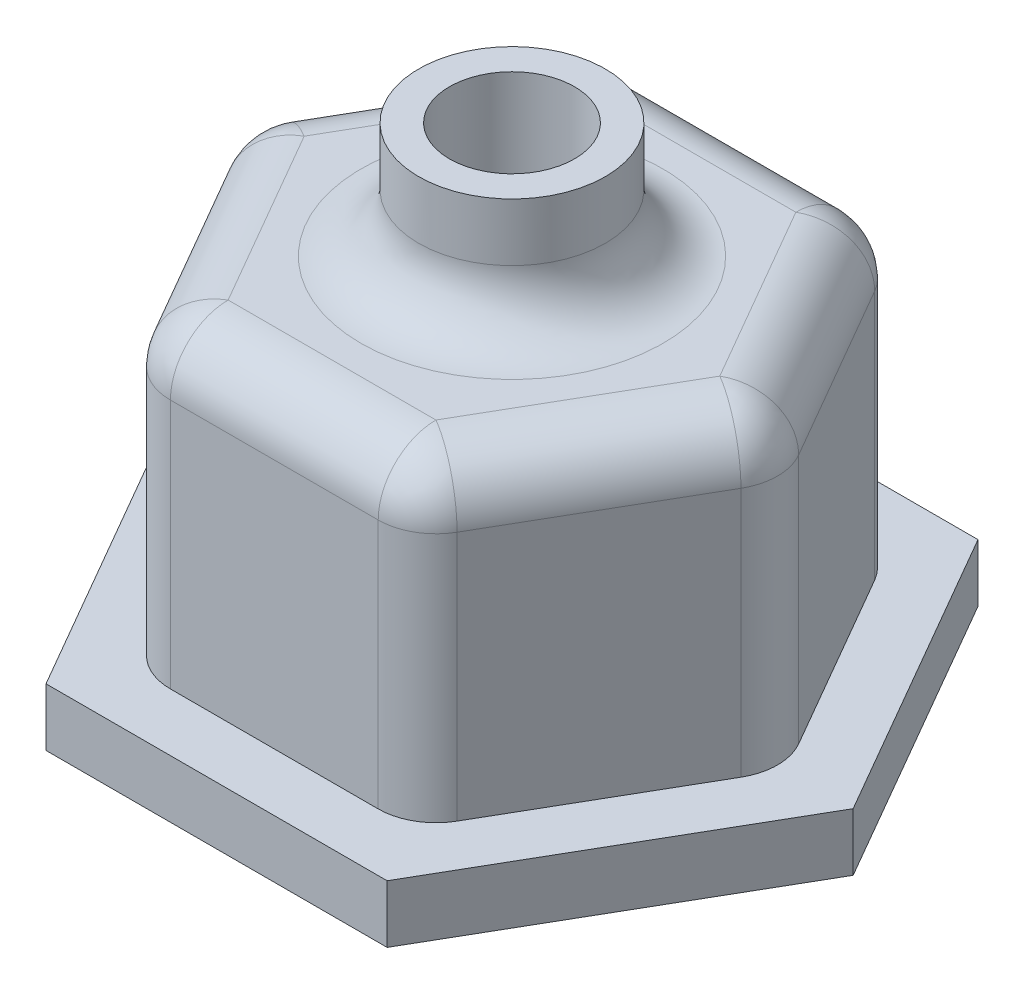
ISO-10303-21;
HEADER;
FILE_DESCRIPTION(('STEP AP214'),'2;1');
FILE_NAME('part.step','',(''),(''),'','','');
FILE_SCHEMA(('AUTOMOTIVE_DESIGN { 1 0 10303 214 1 1 1 1 }'));
ENDSEC;
DATA;
#1=APPLICATION_CONTEXT('core data for automotive mechanical design processes');
#2=APPLICATION_PROTOCOL_DEFINITION('international standard','automotive_design',2000,#1);
#3=PRODUCT_CONTEXT('',#1,'mechanical');
#4=PRODUCT('Part','Part','',(#3));
#5=PRODUCT_RELATED_PRODUCT_CATEGORY('part','',(#4));
#6=PRODUCT_DEFINITION_FORMATION('','',#4);
#7=PRODUCT_DEFINITION_CONTEXT('part definition',#1,'design');
#8=PRODUCT_DEFINITION('design','',#6,#7);
#9=PRODUCT_DEFINITION_SHAPE('','',#8);
#10=(LENGTH_UNIT() NAMED_UNIT(*) SI_UNIT(.MILLI.,.METRE.));
#11=(NAMED_UNIT(*) PLANE_ANGLE_UNIT() SI_UNIT($,.RADIAN.));
#12=(NAMED_UNIT(*) SI_UNIT($,.STERADIAN.) SOLID_ANGLE_UNIT());
#13=UNCERTAINTY_MEASURE_WITH_UNIT(LENGTH_MEASURE(1.E-05),#10,'distance_accuracy_value','');
#14=(GEOMETRIC_REPRESENTATION_CONTEXT(3) GLOBAL_UNCERTAINTY_ASSIGNED_CONTEXT((#13)) GLOBAL_UNIT_ASSIGNED_CONTEXT((#10,
#11,#12)) REPRESENTATION_CONTEXT('',''));
#15=CARTESIAN_POINT('',(0.,0.,0.));
#16=DIRECTION('',(0.,0.,1.));
#17=DIRECTION('',(1.,0.,0.));
#18=AXIS2_PLACEMENT_3D('',#15,#16,#17);
#19=CARTESIAN_POINT('',(0.,8.,0.));
#20=DIRECTION('',(0.,1.,0.));
#21=DIRECTION('',(0.,0.,1.));
#22=AXIS2_PLACEMENT_3D('',#19,#20,#21);
#23=PLANE('',#22);
#24=DIRECTION('',(0.,0.,1.));
#25=VECTOR('',#24,1.);
#26=CARTESIAN_POINT('',(-1.15,8.,-1.1480962503205));
#27=LINE('',#26,#25);
#28=CARTESIAN_POINT('',(-1.15,8.,-1.1480962503205));
#29=VERTEX_POINT('',#28);
#30=CARTESIAN_POINT('',(-1.15,8.,1.1480962503205));
#31=VERTEX_POINT('',#30);
#32=EDGE_CURVE('E196',#29,#31,#27,.T.);
#33=ORIENTED_EDGE('',*,*,#32,.F.);
#34=CARTESIAN_POINT('',(0.,8.,0.));
#35=DIRECTION('',(0.,1.,0.));
#36=DIRECTION('',(0.,0.,1.));
#37=AXIS2_PLACEMENT_3D('',#34,#35,#36);
#38=CIRCLE('',#37,1.625);
#39=EDGE_CURVE('E194',#29,#31,#38,.T.);
#40=ORIENTED_EDGE('',*,*,#39,.T.);
#41=EDGE_LOOP('',(#33,#40));
#42=FACE_BOUND('',#41,.T.);
#43=ADVANCED_FACE('F39',(#42),#23,.T.);
#44=DIRECTION('',(-0.500000000000007,0.,-0.866025403784435));
#45=VECTOR('',#44,1.);
#46=CARTESIAN_POINT('',(2.26609980656923,8.,-5.42500000000002));
#47=LINE('',#46,#45);
#48=CARTESIAN_POINT('',(5.398225016923,8.,0.));
#49=VERTEX_POINT('',#48);
#50=CARTESIAN_POINT('',(2.69911250846146,8.,-4.67500000000002));
#51=VERTEX_POINT('',#50);
#52=EDGE_CURVE('E247',#49,#51,#47,.T.);
#53=ORIENTED_EDGE('',*,*,#52,.T.);
#54=DIRECTION('',(-1.,0.,0.));
#55=VECTOR('',#54,1.);
#56=CARTESIAN_POINT('',(-3.565137912246,8.,-4.67499999999996));
#57=LINE('',#56,#55);
#58=CARTESIAN_POINT('',(-2.69911250846156,8.,-4.67499999999997));
#59=VERTEX_POINT('',#58);
#60=EDGE_CURVE('E249',#51,#59,#57,.T.);
#61=ORIENTED_EDGE('',*,*,#60,.T.);
#62=DIRECTION('',(-0.499999999999995,0.,0.866025403784442));
#63=VECTOR('',#62,1.);
#64=CARTESIAN_POINT('',(-5.83123771881522,8.,0.749999999999992));
#65=LINE('',#64,#63);
#66=CARTESIAN_POINT('',(-5.398225016923,8.,0.));
#67=VERTEX_POINT('',#66);
#68=EDGE_CURVE('E239',#59,#67,#65,.T.);
#69=ORIENTED_EDGE('',*,*,#68,.T.);
#70=DIRECTION('',(0.500000000000001,0.,0.866025403784438));
#71=VECTOR('',#70,1.);
#72=CARTESIAN_POINT('',(-2.26609980656927,8.,5.42500000000001));
#73=LINE('',#72,#71);
#74=CARTESIAN_POINT('',(-2.69911250846149,8.,4.675));
#75=VERTEX_POINT('',#74);
#76=EDGE_CURVE('E241',#67,#75,#73,.T.);
#77=ORIENTED_EDGE('',*,*,#76,.T.);
#78=DIRECTION('',(1.,0.,0.));
#79=VECTOR('',#78,1.);
#80=CARTESIAN_POINT('',(3.56513791224596,8.,4.67499999999998));
#81=LINE('',#80,#79);
#82=CARTESIAN_POINT('',(2.69911250846152,8.,4.67499999999999));
#83=VERTEX_POINT('',#82);
#84=EDGE_CURVE('E243',#75,#83,#81,.T.);
#85=ORIENTED_EDGE('',*,*,#84,.T.);
#86=DIRECTION('',(0.499999999999995,0.,-0.866025403784442));
#87=VECTOR('',#86,1.);
#88=CARTESIAN_POINT('',(5.83123771881522,8.,-0.750000000000043));
#89=LINE('',#88,#87);
#90=EDGE_CURVE('E245',#83,#49,#89,.T.);
#91=ORIENTED_EDGE('',*,*,#90,.T.);
#92=EDGE_LOOP('',(#53,#61,#69,#77,#85,#91));
#93=FACE_BOUND('',#92,.T.);
#94=CARTESIAN_POINT('',(0.,8.,0.));
#95=DIRECTION('',(0.,1.,0.));
#96=DIRECTION('',(0.,0.,1.));
#97=AXIS2_PLACEMENT_3D('',#94,#95,#96);
#98=CIRCLE('',#97,3.925);
#99=CARTESIAN_POINT('',(0.,8.,3.925));
#100=VERTEX_POINT('',#99);
#101=EDGE_CURVE('E236',#100,#100,#98,.F.);
#102=ORIENTED_EDGE('',*,*,#101,.T.);
#103=EDGE_LOOP('',(#102));
#104=FACE_BOUND('',#103,.T.);
#105=ADVANCED_FACE('F363',(#93,#104),#23,.T.);
#106=CARTESIAN_POINT('',(-3.56513791224601,8.,-6.17499999999996));
#107=DIRECTION('',(0.866025403784442,0.,0.499999999999995));
#108=DIRECTION('',(0.499999999999995,0.,-0.866025403784442));
#109=AXIS2_PLACEMENT_3D('',#106,#107,#108);
#110=PLANE('',#109);
#111=DIRECTION('',(-0.499999999999995,0.,0.866025403784442));
#112=VECTOR('',#111,1.);
#113=CARTESIAN_POINT('',(-3.56513791224601,0.,-6.17499999999996));
#114=LINE('',#113,#112);
#115=CARTESIAN_POINT('',(-3.99815061413822,0.,-5.42499999999996));
#116=VERTEX_POINT('',#115);
#117=CARTESIAN_POINT('',(-6.69726312259967,0.,-0.749999999999998));
#118=VERTEX_POINT('',#117);
#119=EDGE_CURVE('E216',#116,#118,#114,.T.);
#120=ORIENTED_EDGE('',*,*,#119,.T.);
#121=DIRECTION('',(0.,-1.,0.));
#122=VECTOR('',#121,1.);
#123=CARTESIAN_POINT('',(-6.69726312259966,8.,-0.75));
#124=LINE('',#123,#122);
#125=CARTESIAN_POINT('',(-6.69726312259967,6.5,-0.749999999999998));
#126=VERTEX_POINT('',#125);
#127=EDGE_CURVE('E56',#118,#126,#124,.F.);
#128=ORIENTED_EDGE('',*,*,#127,.T.);
#129=DIRECTION('',(-0.499999999999995,0.,0.866025403784442));
#130=VECTOR('',#129,1.);
#131=CARTESIAN_POINT('',(-3.56513791224601,6.5,-6.17499999999996));
#132=LINE('',#131,#130);
#133=CARTESIAN_POINT('',(-3.99815061413822,6.5,-5.42499999999996));
#134=VERTEX_POINT('',#133);
#135=EDGE_CURVE('E61',#126,#134,#132,.F.);
#136=ORIENTED_EDGE('',*,*,#135,.T.);
#137=DIRECTION('',(0.,-1.,0.));
#138=VECTOR('',#137,1.);
#139=CARTESIAN_POINT('',(-3.99815061413822,8.,-5.42499999999996));
#140=LINE('',#139,#138);
#141=EDGE_CURVE('E283',#134,#116,#140,.T.);
#142=ORIENTED_EDGE('',*,*,#141,.T.);
#143=EDGE_LOOP('',(#120,#128,#136,#142));
#144=FACE_BOUND('',#143,.T.);
#145=ADVANCED_FACE('F459',(#144),#110,.F.);
#146=CARTESIAN_POINT('',(-7.13027582449188,8.,0.));
#147=DIRECTION('',(0.866025403784438,0.,-0.500000000000001));
#148=DIRECTION('',(-0.500000000000001,0.,-0.866025403784438));
#149=AXIS2_PLACEMENT_3D('',#146,#147,#148);
#150=PLANE('',#149);
#151=DIRECTION('',(0.500000000000001,0.,0.866025403784438));
#152=VECTOR('',#151,1.);
#153=CARTESIAN_POINT('',(-7.13027582449188,0.,0.));
#154=LINE('',#153,#152);
#155=CARTESIAN_POINT('',(-6.69726312259966,0.,0.749999999999996));
#156=VERTEX_POINT('',#155);
#157=CARTESIAN_POINT('',(-3.99815061413815,0.,5.42500000000001));
#158=VERTEX_POINT('',#157);
#159=EDGE_CURVE('E221',#156,#158,#154,.T.);
#160=ORIENTED_EDGE('',*,*,#159,.T.);
#161=DIRECTION('',(0.,-1.,0.));
#162=VECTOR('',#161,1.);
#163=CARTESIAN_POINT('',(-3.99815061413815,8.,5.42500000000001));
#164=LINE('',#163,#162);
#165=CARTESIAN_POINT('',(-3.99815061413815,6.5,5.42500000000001));
#166=VERTEX_POINT('',#165);
#167=EDGE_CURVE('E281',#158,#166,#164,.F.);
#168=ORIENTED_EDGE('',*,*,#167,.T.);
#169=DIRECTION('',(0.500000000000001,0.,0.866025403784438));
#170=VECTOR('',#169,1.);
#171=CARTESIAN_POINT('',(-7.13027582449188,6.5,0.));
#172=LINE('',#171,#170);
#173=CARTESIAN_POINT('',(-6.69726312259966,6.5,0.749999999999996));
#174=VERTEX_POINT('',#173);
#175=EDGE_CURVE('E279',#166,#174,#172,.F.);
#176=ORIENTED_EDGE('',*,*,#175,.T.);
#177=DIRECTION('',(0.,-1.,0.));
#178=VECTOR('',#177,1.);
#179=CARTESIAN_POINT('',(-6.69726312259966,8.,0.749999999999996));
#180=LINE('',#179,#178);
#181=EDGE_CURVE('E277',#174,#156,#180,.T.);
#182=ORIENTED_EDGE('',*,*,#181,.T.);
#183=EDGE_LOOP('',(#160,#168,#176,#182));
#184=FACE_BOUND('',#183,.T.);
#185=ADVANCED_FACE('F388',(#184),#150,.F.);
#186=CARTESIAN_POINT('',(-3.56513791224592,8.,6.17500000000001));
#187=DIRECTION('',(0.,0.,-1.));
#188=DIRECTION('',(-1.,0.,0.));
#189=AXIS2_PLACEMENT_3D('',#186,#187,#188);
#190=PLANE('',#189);
#191=DIRECTION('',(1.,0.,0.));
#192=VECTOR('',#191,1.);
#193=CARTESIAN_POINT('',(-3.56513791224592,0.,6.17500000000001));
#194=LINE('',#193,#192);
#195=CARTESIAN_POINT('',(-2.69911250846148,0.,6.175));
#196=VERTEX_POINT('',#195);
#197=CARTESIAN_POINT('',(2.69911250846153,0.,6.17499999999999));
#198=VERTEX_POINT('',#197);
#199=EDGE_CURVE('E224',#196,#198,#194,.T.);
#200=ORIENTED_EDGE('',*,*,#199,.T.);
#201=DIRECTION('',(0.,-1.,0.));
#202=VECTOR('',#201,1.);
#203=CARTESIAN_POINT('',(2.69911250846153,8.,6.17499999999999));
#204=LINE('',#203,#202);
#205=CARTESIAN_POINT('',(2.69911250846153,6.5,6.17499999999999));
#206=VERTEX_POINT('',#205);
#207=EDGE_CURVE('E275',#198,#206,#204,.F.);
#208=ORIENTED_EDGE('',*,*,#207,.T.);
#209=DIRECTION('',(1.,0.,0.));
#210=VECTOR('',#209,1.);
#211=CARTESIAN_POINT('',(-3.56513791224592,6.5,6.17500000000001));
#212=LINE('',#211,#210);
#213=CARTESIAN_POINT('',(-2.69911250846148,6.5,6.175));
#214=VERTEX_POINT('',#213);
#215=EDGE_CURVE('E273',#206,#214,#212,.F.);
#216=ORIENTED_EDGE('',*,*,#215,.T.);
#217=DIRECTION('',(0.,-1.,0.));
#218=VECTOR('',#217,1.);
#219=CARTESIAN_POINT('',(-2.69911250846148,8.,6.175));
#220=LINE('',#219,#218);
#221=EDGE_CURVE('E271',#214,#196,#220,.T.);
#222=ORIENTED_EDGE('',*,*,#221,.T.);
#223=EDGE_LOOP('',(#200,#208,#216,#222));
#224=FACE_BOUND('',#223,.T.);
#225=ADVANCED_FACE('F375',(#224),#190,.F.);
#226=CARTESIAN_POINT('',(3.56513791224597,8.,6.17499999999998));
#227=DIRECTION('',(-0.866025403784442,0.,-0.499999999999995));
#228=DIRECTION('',(-0.499999999999995,0.,0.866025403784442));
#229=AXIS2_PLACEMENT_3D('',#226,#227,#228);
#230=PLANE('',#229);
#231=DIRECTION('',(0.499999999999995,0.,-0.866025403784442));
#232=VECTOR('',#231,1.);
#233=CARTESIAN_POINT('',(3.56513791224597,0.,6.17499999999998));
#234=LINE('',#233,#232);
#235=CARTESIAN_POINT('',(3.99815061413818,0.,5.42499999999998));
#236=VERTEX_POINT('',#235);
#237=CARTESIAN_POINT('',(6.69726312259966,0.,0.749999999999954));
#238=VERTEX_POINT('',#237);
#239=EDGE_CURVE('E227',#236,#238,#234,.T.);
#240=ORIENTED_EDGE('',*,*,#239,.T.);
#241=DIRECTION('',(0.,-1.,0.));
#242=VECTOR('',#241,1.);
#243=CARTESIAN_POINT('',(6.69726312259966,8.,0.749999999999954));
#244=LINE('',#243,#242);
#245=CARTESIAN_POINT('',(6.69726312259966,6.5,0.749999999999955));
#246=VERTEX_POINT('',#245);
#247=EDGE_CURVE('E269',#238,#246,#244,.F.);
#248=ORIENTED_EDGE('',*,*,#247,.T.);
#249=DIRECTION('',(0.499999999999995,0.,-0.866025403784442));
#250=VECTOR('',#249,1.);
#251=CARTESIAN_POINT('',(3.56513791224597,6.5,6.17499999999998));
#252=LINE('',#251,#250);
#253=CARTESIAN_POINT('',(3.99815061413818,6.5,5.42499999999998));
#254=VERTEX_POINT('',#253);
#255=EDGE_CURVE('E267',#246,#254,#252,.F.);
#256=ORIENTED_EDGE('',*,*,#255,.T.);
#257=DIRECTION('',(0.,-1.,0.));
#258=VECTOR('',#257,1.);
#259=CARTESIAN_POINT('',(3.99815061413818,8.,5.42499999999998));
#260=LINE('',#259,#258);
#261=EDGE_CURVE('E265',#254,#236,#260,.T.);
#262=ORIENTED_EDGE('',*,*,#261,.T.);
#263=EDGE_LOOP('',(#240,#248,#256,#262));
#264=FACE_BOUND('',#263,.T.);
#265=ADVANCED_FACE('F442',(#264),#230,.F.);
#266=CARTESIAN_POINT('',(7.13027582449188,8.,0.));
#267=DIRECTION('',(-0.866025403784435,0.,0.500000000000007));
#268=DIRECTION('',(0.500000000000007,0.,0.866025403784435));
#269=AXIS2_PLACEMENT_3D('',#266,#267,#268);
#270=PLANE('',#269);
#271=DIRECTION('',(-0.500000000000007,0.,-0.866025403784435));
#272=VECTOR('',#271,1.);
#273=CARTESIAN_POINT('',(7.13027582449188,0.,0.));
#274=LINE('',#273,#272);
#275=CARTESIAN_POINT('',(6.69726312259965,0.,-0.750000000000048));
#276=VERTEX_POINT('',#275);
#277=CARTESIAN_POINT('',(3.99815061413811,0.,-5.42500000000003));
#278=VERTEX_POINT('',#277);
#279=EDGE_CURVE('E230',#276,#278,#274,.T.);
#280=ORIENTED_EDGE('',*,*,#279,.T.);
#281=DIRECTION('',(0.,-1.,0.));
#282=VECTOR('',#281,1.);
#283=CARTESIAN_POINT('',(3.99815061413811,8.,-5.42500000000003));
#284=LINE('',#283,#282);
#285=CARTESIAN_POINT('',(3.99815061413811,6.5,-5.42500000000003));
#286=VERTEX_POINT('',#285);
#287=EDGE_CURVE('E263',#278,#286,#284,.F.);
#288=ORIENTED_EDGE('',*,*,#287,.T.);
#289=DIRECTION('',(-0.500000000000007,0.,-0.866025403784435));
#290=VECTOR('',#289,1.);
#291=CARTESIAN_POINT('',(7.13027582449188,6.5,0.));
#292=LINE('',#291,#290);
#293=CARTESIAN_POINT('',(6.69726312259965,6.5,-0.750000000000048));
#294=VERTEX_POINT('',#293);
#295=EDGE_CURVE('E261',#286,#294,#292,.F.);
#296=ORIENTED_EDGE('',*,*,#295,.T.);
#297=DIRECTION('',(0.,-1.,0.));
#298=VECTOR('',#297,1.);
#299=CARTESIAN_POINT('',(6.69726312259965,8.,-0.750000000000048));
#300=LINE('',#299,#298);
#301=EDGE_CURVE('E259',#294,#276,#300,.T.);
#302=ORIENTED_EDGE('',*,*,#301,.T.);
#303=EDGE_LOOP('',(#280,#288,#296,#302));
#304=FACE_BOUND('',#303,.T.);
#305=ADVANCED_FACE('F429',(#304),#270,.F.);
#306=CARTESIAN_POINT('',(3.56513791224588,8.,-6.17500000000003));
#307=DIRECTION('',(0.,0.,1.));
#308=DIRECTION('',(1.,0.,0.));
#309=AXIS2_PLACEMENT_3D('',#306,#307,#308);
#310=PLANE('',#309);
#311=DIRECTION('',(-1.,0.,0.));
#312=VECTOR('',#311,1.);
#313=CARTESIAN_POINT('',(3.56513791224588,6.5,-6.17500000000003));
#314=LINE('',#313,#312);
#315=CARTESIAN_POINT('',(-2.69911250846158,6.5,-6.17499999999997));
#316=VERTEX_POINT('',#315);
#317=CARTESIAN_POINT('',(2.69911250846144,6.5,-6.17500000000002));
#318=VERTEX_POINT('',#317);
#319=EDGE_CURVE('E254',#316,#318,#314,.F.);
#320=ORIENTED_EDGE('',*,*,#319,.T.);
#321=DIRECTION('',(0.,-1.,0.));
#322=VECTOR('',#321,1.);
#323=CARTESIAN_POINT('',(2.69911250846144,8.,-6.17500000000002));
#324=LINE('',#323,#322);
#325=CARTESIAN_POINT('',(2.69911250846144,0.,-6.17500000000002));
#326=VERTEX_POINT('',#325);
#327=EDGE_CURVE('E257',#318,#326,#324,.T.);
#328=ORIENTED_EDGE('',*,*,#327,.T.);
#329=DIRECTION('',(-1.,0.,0.));
#330=VECTOR('',#329,1.);
#331=CARTESIAN_POINT('',(3.56513791224588,0.,-6.17500000000003));
#332=LINE('',#331,#330);
#333=CARTESIAN_POINT('',(-2.69911250846158,0.,-6.17499999999997));
#334=VERTEX_POINT('',#333);
#335=EDGE_CURVE('E233',#326,#334,#332,.T.);
#336=ORIENTED_EDGE('',*,*,#335,.T.);
#337=DIRECTION('',(0.,-1.,0.));
#338=VECTOR('',#337,1.);
#339=CARTESIAN_POINT('',(-2.69911250846158,8.,-6.17499999999997));
#340=LINE('',#339,#338);
#341=EDGE_CURVE('E252',#334,#316,#340,.F.);
#342=ORIENTED_EDGE('',*,*,#341,.T.);
#343=EDGE_LOOP('',(#320,#328,#336,#342));
#344=FACE_BOUND('',#343,.T.);
#345=ADVANCED_FACE('F417',(#344),#310,.F.);
#346=CARTESIAN_POINT('',(0.,8.,0.));
#347=DIRECTION('',(0.,-1.,0.));
#348=DIRECTION('',(0.,0.,-1.));
#349=AXIS2_PLACEMENT_3D('',#346,#347,#348);
#350=CYLINDRICAL_SURFACE('',#349,1.625);
#351=DIRECTION('',(0.,-1.,0.));
#352=VECTOR('',#351,1.);
#353=CARTESIAN_POINT('',(-1.15,8.,-1.1480962503205));
#354=LINE('',#353,#352);
#355=CARTESIAN_POINT('',(-1.15,-1.5,-1.1480962503205));
#356=VERTEX_POINT('',#355);
#357=EDGE_CURVE('E207',#29,#356,#354,.T.);
#358=ORIENTED_EDGE('',*,*,#357,.T.);
#359=CARTESIAN_POINT('',(0.,-1.5,0.));
#360=DIRECTION('',(0.,-1.,0.));
#361=DIRECTION('',(0.,0.,-1.));
#362=AXIS2_PLACEMENT_3D('',#359,#360,#361);
#363=CIRCLE('',#362,1.625);
#364=CARTESIAN_POINT('',(-1.15,-1.5,1.1480962503205));
#365=VERTEX_POINT('',#364);
#366=EDGE_CURVE('E213',#356,#365,#363,.T.);
#367=ORIENTED_EDGE('',*,*,#366,.T.);
#368=DIRECTION('',(0.,-1.,0.));
#369=VECTOR('',#368,1.);
#370=CARTESIAN_POINT('',(-1.15,8.,1.1480962503205));
#371=LINE('',#370,#369);
#372=EDGE_CURVE('E205',#31,#365,#371,.T.);
#373=ORIENTED_EDGE('',*,*,#372,.F.);
#374=ORIENTED_EDGE('',*,*,#39,.F.);
#375=EDGE_LOOP('',(#358,#367,#373,#374));
#376=FACE_BOUND('',#375,.T.);
#377=CARTESIAN_POINT('',(0.,11.,0.));
#378=DIRECTION('',(0.,1.,0.));
#379=DIRECTION('',(0.,0.,1.));
#380=AXIS2_PLACEMENT_3D('',#377,#378,#379);
#381=CIRCLE('',#380,1.625);
#382=CARTESIAN_POINT('',(0.,11.,1.625));
#383=VERTEX_POINT('',#382);
#384=EDGE_CURVE('E200',#383,#383,#381,.T.);
#385=ORIENTED_EDGE('',*,*,#384,.T.);
#386=EDGE_LOOP('',(#385));
#387=FACE_BOUND('',#386,.T.);
#388=ADVANCED_FACE('F210',(#376,#387),#350,.F.);
#389=CARTESIAN_POINT('',(-1.15,8.,-1.1480962503205));
#390=DIRECTION('',(1.,0.,0.));
#391=DIRECTION('',(0.,0.,-1.));
#392=AXIS2_PLACEMENT_3D('',#389,#390,#391);
#393=PLANE('',#392);
#394=ORIENTED_EDGE('',*,*,#372,.T.);
#395=DIRECTION('',(0.,0.,-1.));
#396=VECTOR('',#395,1.);
#397=CARTESIAN_POINT('',(-1.15,-1.5,-1.1480962503205));
#398=LINE('',#397,#396);
#399=EDGE_CURVE('E798',#365,#356,#398,.T.);
#400=ORIENTED_EDGE('',*,*,#399,.T.);
#401=ORIENTED_EDGE('',*,*,#357,.F.);
#402=ORIENTED_EDGE('',*,*,#32,.T.);
#403=EDGE_LOOP('',(#394,#400,#401,#402));
#404=FACE_BOUND('',#403,.T.);
#405=ADVANCED_FACE('F203',(#404),#393,.T.);
#406=CARTESIAN_POINT('',(0.,0.,0.));
#407=DIRECTION('',(0.,-1.,0.));
#408=DIRECTION('',(0.,0.,-1.));
#409=AXIS2_PLACEMENT_3D('',#406,#407,#408);
#410=PLANE('',#409);
#411=DIRECTION('',(-1.,0.,0.));
#412=VECTOR('',#411,1.);
#413=CARTESIAN_POINT('',(4.43116331603038,0.,7.67500000000001));
#414=LINE('',#413,#412);
#415=CARTESIAN_POINT('',(4.43116331603038,0.,7.67500000000001));
#416=VERTEX_POINT('',#415);
#417=CARTESIAN_POINT('',(-4.43116331603038,0.,7.67500000000001));
#418=VERTEX_POINT('',#417);
#419=EDGE_CURVE('E790',#416,#418,#414,.T.);
#420=ORIENTED_EDGE('',*,*,#419,.F.);
#421=DIRECTION('',(-0.5,0.,0.866025403784439));
#422=VECTOR('',#421,1.);
#423=CARTESIAN_POINT('',(8.86232663206077,0.,0.));
#424=LINE('',#423,#422);
#425=CARTESIAN_POINT('',(8.86232663206077,0.,0.));
#426=VERTEX_POINT('',#425);
#427=EDGE_CURVE('E792',#426,#416,#424,.T.);
#428=ORIENTED_EDGE('',*,*,#427,.F.);
#429=DIRECTION('',(0.5,0.,0.866025403784439));
#430=VECTOR('',#429,1.);
#431=CARTESIAN_POINT('',(4.43116331603038,0.,-7.67500000000001));
#432=LINE('',#431,#430);
#433=CARTESIAN_POINT('',(4.43116331603038,0.,-7.67500000000001));
#434=VERTEX_POINT('',#433);
#435=EDGE_CURVE('E810',#434,#426,#432,.T.);
#436=ORIENTED_EDGE('',*,*,#435,.F.);
#437=DIRECTION('',(1.,0.,0.));
#438=VECTOR('',#437,1.);
#439=CARTESIAN_POINT('',(-4.43116331603038,0.,-7.67500000000001));
#440=LINE('',#439,#438);
#441=CARTESIAN_POINT('',(-4.43116331603038,0.,-7.67500000000001));
#442=VERTEX_POINT('',#441);
#443=EDGE_CURVE('E808',#442,#434,#440,.T.);
#444=ORIENTED_EDGE('',*,*,#443,.F.);
#445=DIRECTION('',(0.5,0.,-0.866025403784439));
#446=VECTOR('',#445,1.);
#447=CARTESIAN_POINT('',(-8.86232663206076,0.,0.));
#448=LINE('',#447,#446);
#449=CARTESIAN_POINT('',(-8.86232663206076,0.,0.));
#450=VERTEX_POINT('',#449);
#451=EDGE_CURVE('E800',#450,#442,#448,.T.);
#452=ORIENTED_EDGE('',*,*,#451,.F.);
#453=DIRECTION('',(-0.5,0.,-0.866025403784439));
#454=VECTOR('',#453,1.);
#455=CARTESIAN_POINT('',(-4.43116331603038,0.,7.67500000000001));
#456=LINE('',#455,#454);
#457=EDGE_CURVE('E794',#418,#450,#456,.T.);
#458=ORIENTED_EDGE('',*,*,#457,.F.);
#459=EDGE_LOOP('',(#420,#428,#436,#444,#452,#458));
#460=FACE_BOUND('',#459,.T.);
#461=ORIENTED_EDGE('',*,*,#159,.F.);
#462=CARTESIAN_POINT('',(-5.398225016923,0.,0.));
#463=DIRECTION('',(0.,-1.,0.));
#464=DIRECTION('',(0.,0.,-1.));
#465=AXIS2_PLACEMENT_3D('',#462,#463,#464);
#466=CIRCLE('',#465,1.5);
#467=EDGE_CURVE('E48',#156,#118,#466,.T.);
#468=ORIENTED_EDGE('',*,*,#467,.T.);
#469=ORIENTED_EDGE('',*,*,#119,.F.);
#470=CARTESIAN_POINT('',(-2.69911250846156,0.,-4.67499999999997));
#471=DIRECTION('',(0.,-1.,0.));
#472=DIRECTION('',(0.,0.,-1.));
#473=AXIS2_PLACEMENT_3D('',#470,#471,#472);
#474=CIRCLE('',#473,1.5);
#475=EDGE_CURVE('E12',#116,#334,#474,.T.);
#476=ORIENTED_EDGE('',*,*,#475,.T.);
#477=ORIENTED_EDGE('',*,*,#335,.F.);
#478=CARTESIAN_POINT('',(2.69911250846146,0.,-4.67500000000002));
#479=DIRECTION('',(0.,-1.,0.));
#480=DIRECTION('',(0.,0.,-1.));
#481=AXIS2_PLACEMENT_3D('',#478,#479,#480);
#482=CIRCLE('',#481,1.5);
#483=EDGE_CURVE('E290',#326,#278,#482,.T.);
#484=ORIENTED_EDGE('',*,*,#483,.T.);
#485=ORIENTED_EDGE('',*,*,#279,.F.);
#486=CARTESIAN_POINT('',(5.398225016923,0.,0.));
#487=DIRECTION('',(0.,-1.,0.));
#488=DIRECTION('',(0.,0.,-1.));
#489=AXIS2_PLACEMENT_3D('',#486,#487,#488);
#490=CIRCLE('',#489,1.5);
#491=EDGE_CURVE('E292',#276,#238,#490,.T.);
#492=ORIENTED_EDGE('',*,*,#491,.T.);
#493=ORIENTED_EDGE('',*,*,#239,.F.);
#494=CARTESIAN_POINT('',(2.69911250846152,0.,4.67499999999998));
#495=DIRECTION('',(0.,-1.,0.));
#496=DIRECTION('',(0.,0.,-1.));
#497=AXIS2_PLACEMENT_3D('',#494,#495,#496);
#498=CIRCLE('',#497,1.5);
#499=EDGE_CURVE('E294',#236,#198,#498,.T.);
#500=ORIENTED_EDGE('',*,*,#499,.T.);
#501=ORIENTED_EDGE('',*,*,#199,.F.);
#502=CARTESIAN_POINT('',(-2.69911250846149,0.,4.675));
#503=DIRECTION('',(0.,-1.,0.));
#504=DIRECTION('',(0.,0.,-1.));
#505=AXIS2_PLACEMENT_3D('',#502,#503,#504);
#506=CIRCLE('',#505,1.5);
#507=EDGE_CURVE('E296',#196,#158,#506,.T.);
#508=ORIENTED_EDGE('',*,*,#507,.T.);
#509=EDGE_LOOP('',(#461,#468,#469,#476,#477,#484,#485,#492,#493,#500,#501,#508));
#510=FACE_BOUND('',#509,.T.);
#511=ADVANCED_FACE('F385',(#460,#510),#410,.F.);
#512=CARTESIAN_POINT('',(0.,-1.5,0.));
#513=DIRECTION('',(0.,-1.,0.));
#514=DIRECTION('',(0.,0.,-1.));
#515=AXIS2_PLACEMENT_3D('',#512,#513,#514);
#516=PLANE('',#515);
#517=DIRECTION('',(-1.,0.,0.));
#518=VECTOR('',#517,1.);
#519=CARTESIAN_POINT('',(4.43116331603038,-1.5,7.67500000000001));
#520=LINE('',#519,#518);
#521=CARTESIAN_POINT('',(4.43116331603038,-1.5,7.67500000000001));
#522=VERTEX_POINT('',#521);
#523=CARTESIAN_POINT('',(-4.43116331603038,-1.5,7.67500000000001));
#524=VERTEX_POINT('',#523);
#525=EDGE_CURVE('E813',#522,#524,#520,.T.);
#526=ORIENTED_EDGE('',*,*,#525,.T.);
#527=DIRECTION('',(-0.5,0.,-0.866025403784439));
#528=VECTOR('',#527,1.);
#529=CARTESIAN_POINT('',(-4.43116331603038,-1.5,7.67500000000001));
#530=LINE('',#529,#528);
#531=CARTESIAN_POINT('',(-8.86232663206076,-1.5,0.));
#532=VERTEX_POINT('',#531);
#533=EDGE_CURVE('E828',#524,#532,#530,.T.);
#534=ORIENTED_EDGE('',*,*,#533,.T.);
#535=DIRECTION('',(0.5,0.,-0.866025403784439));
#536=VECTOR('',#535,1.);
#537=CARTESIAN_POINT('',(-8.86232663206076,-1.5,0.));
#538=LINE('',#537,#536);
#539=CARTESIAN_POINT('',(-4.43116331603038,-1.5,-7.67500000000001));
#540=VERTEX_POINT('',#539);
#541=EDGE_CURVE('E833',#532,#540,#538,.T.);
#542=ORIENTED_EDGE('',*,*,#541,.T.);
#543=DIRECTION('',(1.,0.,0.));
#544=VECTOR('',#543,1.);
#545=CARTESIAN_POINT('',(-4.43116331603038,-1.5,-7.67500000000001));
#546=LINE('',#545,#544);
#547=CARTESIAN_POINT('',(4.43116331603038,-1.5,-7.67500000000001));
#548=VERTEX_POINT('',#547);
#549=EDGE_CURVE('E838',#540,#548,#546,.T.);
#550=ORIENTED_EDGE('',*,*,#549,.T.);
#551=DIRECTION('',(0.5,0.,0.866025403784439));
#552=VECTOR('',#551,1.);
#553=CARTESIAN_POINT('',(4.43116331603038,-1.5,-7.67500000000001));
#554=LINE('',#553,#552);
#555=CARTESIAN_POINT('',(8.86232663206077,-1.5,0.));
#556=VERTEX_POINT('',#555);
#557=EDGE_CURVE('E839',#548,#556,#554,.T.);
#558=ORIENTED_EDGE('',*,*,#557,.T.);
#559=DIRECTION('',(-0.5,0.,0.866025403784439));
#560=VECTOR('',#559,1.);
#561=CARTESIAN_POINT('',(8.86232663206077,-1.5,0.));
#562=LINE('',#561,#560);
#563=EDGE_CURVE('E804',#556,#522,#562,.T.);
#564=ORIENTED_EDGE('',*,*,#563,.T.);
#565=EDGE_LOOP('',(#526,#534,#542,#550,#558,#564));
#566=FACE_BOUND('',#565,.T.);
#567=ORIENTED_EDGE('',*,*,#399,.F.);
#568=ORIENTED_EDGE('',*,*,#366,.F.);
#569=EDGE_LOOP('',(#567,#568));
#570=FACE_BOUND('',#569,.T.);
#571=ADVANCED_FACE('F708',(#566,#570),#516,.T.);
#572=CARTESIAN_POINT('',(4.43116331603038,-1.5,7.67500000000001));
#573=DIRECTION('',(0.,0.,-1.));
#574=DIRECTION('',(-1.,0.,0.));
#575=AXIS2_PLACEMENT_3D('',#572,#573,#574);
#576=PLANE('',#575);
#577=ORIENTED_EDGE('',*,*,#419,.T.);
#578=DIRECTION('',(0.,1.,0.));
#579=VECTOR('',#578,1.);
#580=CARTESIAN_POINT('',(-4.43116331603038,-1.5,7.67500000000001));
#581=LINE('',#580,#579);
#582=EDGE_CURVE('E208',#524,#418,#581,.T.);
#583=ORIENTED_EDGE('',*,*,#582,.F.);
#584=ORIENTED_EDGE('',*,*,#525,.F.);
#585=DIRECTION('',(0.,1.,0.));
#586=VECTOR('',#585,1.);
#587=CARTESIAN_POINT('',(4.43116331603038,-1.5,7.67500000000001));
#588=LINE('',#587,#586);
#589=EDGE_CURVE('E814',#522,#416,#588,.T.);
#590=ORIENTED_EDGE('',*,*,#589,.T.);
#591=EDGE_LOOP('',(#577,#583,#584,#590));
#592=FACE_BOUND('',#591,.T.);
#593=ADVANCED_FACE('F699',(#592),#576,.F.);
#594=CARTESIAN_POINT('',(-4.43116331603038,-1.5,7.67500000000001));
#595=DIRECTION('',(0.866025403784439,0.,-0.5));
#596=DIRECTION('',(-0.5,0.,-0.866025403784439));
#597=AXIS2_PLACEMENT_3D('',#594,#595,#596);
#598=PLANE('',#597);
#599=ORIENTED_EDGE('',*,*,#457,.T.);
#600=DIRECTION('',(0.,1.,0.));
#601=VECTOR('',#600,1.);
#602=CARTESIAN_POINT('',(-8.86232663206076,-1.5,0.));
#603=LINE('',#602,#601);
#604=EDGE_CURVE('E825',#532,#450,#603,.T.);
#605=ORIENTED_EDGE('',*,*,#604,.F.);
#606=ORIENTED_EDGE('',*,*,#533,.F.);
#607=ORIENTED_EDGE('',*,*,#582,.T.);
#608=EDGE_LOOP('',(#599,#605,#606,#607));
#609=FACE_BOUND('',#608,.T.);
#610=ADVANCED_FACE('F690',(#609),#598,.F.);
#611=CARTESIAN_POINT('',(-8.86232663206076,-1.5,0.));
#612=DIRECTION('',(0.866025403784438,0.,0.5));
#613=DIRECTION('',(0.5,0.,-0.866025403784439));
#614=AXIS2_PLACEMENT_3D('',#611,#612,#613);
#615=PLANE('',#614);
#616=ORIENTED_EDGE('',*,*,#451,.T.);
#617=DIRECTION('',(0.,1.,0.));
#618=VECTOR('',#617,1.);
#619=CARTESIAN_POINT('',(-4.43116331603038,-1.5,-7.67500000000001));
#620=LINE('',#619,#618);
#621=EDGE_CURVE('E822',#540,#442,#620,.T.);
#622=ORIENTED_EDGE('',*,*,#621,.F.);
#623=ORIENTED_EDGE('',*,*,#541,.F.);
#624=ORIENTED_EDGE('',*,*,#604,.T.);
#625=EDGE_LOOP('',(#616,#622,#623,#624));
#626=FACE_BOUND('',#625,.T.);
#627=ADVANCED_FACE('F681',(#626),#615,.F.);
#628=CARTESIAN_POINT('',(-4.43116331603038,-1.5,-7.67500000000001));
#629=DIRECTION('',(0.,0.,1.));
#630=DIRECTION('',(1.,0.,0.));
#631=AXIS2_PLACEMENT_3D('',#628,#629,#630);
#632=PLANE('',#631);
#633=ORIENTED_EDGE('',*,*,#443,.T.);
#634=DIRECTION('',(0.,1.,0.));
#635=VECTOR('',#634,1.);
#636=CARTESIAN_POINT('',(4.43116331603038,-1.5,-7.67500000000001));
#637=LINE('',#636,#635);
#638=EDGE_CURVE('E819',#548,#434,#637,.T.);
#639=ORIENTED_EDGE('',*,*,#638,.F.);
#640=ORIENTED_EDGE('',*,*,#549,.F.);
#641=ORIENTED_EDGE('',*,*,#621,.T.);
#642=EDGE_LOOP('',(#633,#639,#640,#641));
#643=FACE_BOUND('',#642,.T.);
#644=ADVANCED_FACE('F672',(#643),#632,.F.);
#645=CARTESIAN_POINT('',(4.43116331603038,-1.5,-7.67500000000001));
#646=DIRECTION('',(-0.866025403784439,0.,0.5));
#647=DIRECTION('',(0.5,0.,0.866025403784439));
#648=AXIS2_PLACEMENT_3D('',#645,#646,#647);
#649=PLANE('',#648);
#650=ORIENTED_EDGE('',*,*,#435,.T.);
#651=DIRECTION('',(0.,1.,0.));
#652=VECTOR('',#651,1.);
#653=CARTESIAN_POINT('',(8.86232663206077,-1.5,0.));
#654=LINE('',#653,#652);
#655=EDGE_CURVE('E816',#556,#426,#654,.T.);
#656=ORIENTED_EDGE('',*,*,#655,.F.);
#657=ORIENTED_EDGE('',*,*,#557,.F.);
#658=ORIENTED_EDGE('',*,*,#638,.T.);
#659=EDGE_LOOP('',(#650,#656,#657,#658));
#660=FACE_BOUND('',#659,.T.);
#661=ADVANCED_FACE('F663',(#660),#649,.F.);
#662=CARTESIAN_POINT('',(8.86232663206077,-1.5,0.));
#663=DIRECTION('',(-0.866025403784438,0.,-0.5));
#664=DIRECTION('',(-0.5,0.,0.866025403784439));
#665=AXIS2_PLACEMENT_3D('',#662,#663,#664);
#666=PLANE('',#665);
#667=ORIENTED_EDGE('',*,*,#427,.T.);
#668=ORIENTED_EDGE('',*,*,#589,.F.);
#669=ORIENTED_EDGE('',*,*,#563,.F.);
#670=ORIENTED_EDGE('',*,*,#655,.T.);
#671=EDGE_LOOP('',(#667,#668,#669,#670));
#672=FACE_BOUND('',#671,.T.);
#673=ADVANCED_FACE('F636',(#672),#666,.F.);
#674=CARTESIAN_POINT('',(0.,11.,0.));
#675=DIRECTION('',(0.,1.,0.));
#676=DIRECTION('',(0.,0.,1.));
#677=AXIS2_PLACEMENT_3D('',#674,#675,#676);
#678=PLANE('',#677);
#679=CARTESIAN_POINT('',(0.,11.,0.));
#680=DIRECTION('',(0.,1.,0.));
#681=DIRECTION('',(1.,0.,0.));
#682=AXIS2_PLACEMENT_3D('',#679,#680,#681);
#683=CIRCLE('',#682,2.425);
#684=CARTESIAN_POINT('',(2.425,11.,0.));
#685=VERTEX_POINT('',#684);
#686=EDGE_CURVE('E849',#685,#685,#683,.T.);
#687=ORIENTED_EDGE('',*,*,#686,.T.);
#688=EDGE_LOOP('',(#687));
#689=FACE_BOUND('',#688,.T.);
#690=ORIENTED_EDGE('',*,*,#384,.F.);
#691=EDGE_LOOP('',(#690));
#692=FACE_BOUND('',#691,.T.);
#693=ADVANCED_FACE('F451',(#689,#692),#678,.T.);
#694=CARTESIAN_POINT('',(0.,11.,0.));
#695=DIRECTION('',(0.,-1.,0.));
#696=DIRECTION('',(0.,0.,-1.));
#697=AXIS2_PLACEMENT_3D('',#694,#695,#696);
#698=CYLINDRICAL_SURFACE('',#697,2.425);
#699=CARTESIAN_POINT('',(0.,9.5,0.));
#700=DIRECTION('',(0.,1.,0.));
#701=DIRECTION('',(0.,0.,1.));
#702=AXIS2_PLACEMENT_3D('',#699,#700,#701);
#703=CIRCLE('',#702,2.425);
#704=CARTESIAN_POINT('',(0.,9.5,2.425));
#705=VERTEX_POINT('',#704);
#706=EDGE_CURVE('E287',#705,#705,#703,.T.);
#707=ORIENTED_EDGE('',*,*,#706,.T.);
#708=EDGE_LOOP('',(#707));
#709=FACE_BOUND('',#708,.T.);
#710=ORIENTED_EDGE('',*,*,#686,.F.);
#711=EDGE_LOOP('',(#710));
#712=FACE_BOUND('',#711,.T.);
#713=ADVANCED_FACE('F445',(#709,#712),#698,.T.);
#714=CARTESIAN_POINT('',(2.69911250846152,8.,4.67499999999998));
#715=DIRECTION('',(0.,-1.,0.));
#716=DIRECTION('',(0.,0.,-1.));
#717=AXIS2_PLACEMENT_3D('',#714,#715,#716);
#718=CYLINDRICAL_SURFACE('',#717,1.5);
#719=ORIENTED_EDGE('',*,*,#499,.F.);
#720=ORIENTED_EDGE('',*,*,#261,.F.);
#721=CARTESIAN_POINT('',(2.69911250846152,6.5,4.67499999999999));
#722=DIRECTION('',(0.,1.,0.));
#723=DIRECTION('',(0.,0.,1.));
#724=AXIS2_PLACEMENT_3D('',#721,#722,#723);
#725=CIRCLE('',#724,1.5);
#726=EDGE_CURVE('E43',#206,#254,#725,.T.);
#727=ORIENTED_EDGE('',*,*,#726,.F.);
#728=ORIENTED_EDGE('',*,*,#207,.F.);
#729=EDGE_LOOP('',(#719,#720,#727,#728));
#730=FACE_BOUND('',#729,.T.);
#731=ADVANCED_FACE('F443',(#730),#718,.T.);
#732=CARTESIAN_POINT('',(0.,6.5,4.675));
#733=DIRECTION('',(-1.,0.,0.));
#734=DIRECTION('',(0.,0.,1.));
#735=AXIS2_PLACEMENT_3D('',#732,#733,#734);
#736=CYLINDRICAL_SURFACE('',#735,1.5);
#737=CARTESIAN_POINT('',(-2.69911250846149,6.5,4.675));
#738=DIRECTION('',(-1.,0.,0.));
#739=DIRECTION('',(0.,0.,1.));
#740=AXIS2_PLACEMENT_3D('',#737,#738,#739);
#741=CIRCLE('',#740,1.5);
#742=EDGE_CURVE('E342',#214,#75,#741,.T.);
#743=ORIENTED_EDGE('',*,*,#742,.F.);
#744=ORIENTED_EDGE('',*,*,#215,.F.);
#745=CARTESIAN_POINT('',(2.69911250846152,6.5,4.67499999999999));
#746=DIRECTION('',(1.,0.,0.));
#747=DIRECTION('',(0.,0.,-1.));
#748=AXIS2_PLACEMENT_3D('',#745,#746,#747);
#749=CIRCLE('',#748,1.5);
#750=EDGE_CURVE('E344',#83,#206,#749,.T.);
#751=ORIENTED_EDGE('',*,*,#750,.F.);
#752=ORIENTED_EDGE('',*,*,#84,.F.);
#753=EDGE_LOOP('',(#743,#744,#751,#752));
#754=FACE_BOUND('',#753,.T.);
#755=ADVANCED_FACE('F372',(#754),#736,.T.);
#756=CARTESIAN_POINT('',(-2.69911250846149,8.,4.675));
#757=DIRECTION('',(0.,-1.,0.));
#758=DIRECTION('',(0.,0.,-1.));
#759=AXIS2_PLACEMENT_3D('',#756,#757,#758);
#760=CYLINDRICAL_SURFACE('',#759,1.5);
#761=ORIENTED_EDGE('',*,*,#507,.F.);
#762=ORIENTED_EDGE('',*,*,#221,.F.);
#763=CARTESIAN_POINT('',(-2.69911250846149,6.5,4.675));
#764=DIRECTION('',(0.,1.,0.));
#765=DIRECTION('',(0.,0.,1.));
#766=AXIS2_PLACEMENT_3D('',#763,#764,#765);
#767=CIRCLE('',#766,1.5);
#768=EDGE_CURVE('E339',#166,#214,#767,.T.);
#769=ORIENTED_EDGE('',*,*,#768,.F.);
#770=ORIENTED_EDGE('',*,*,#167,.F.);
#771=EDGE_LOOP('',(#761,#762,#769,#770));
#772=FACE_BOUND('',#771,.T.);
#773=ADVANCED_FACE('F380',(#772),#760,.T.);
#774=CARTESIAN_POINT('',(2.69911250846152,6.5,4.67499999999999));
#775=DIRECTION('',(0.,0.,1.));
#776=DIRECTION('',(1.,0.,0.));
#777=AXIS2_PLACEMENT_3D('',#774,#775,#776);
#778=SPHERICAL_SURFACE('',#777,1.5);
#779=ORIENTED_EDGE('',*,*,#750,.T.);
#780=ORIENTED_EDGE('',*,*,#726,.T.);
#781=CARTESIAN_POINT('',(2.69911250846152,6.5,4.67499999999998));
#782=DIRECTION('',(-0.499999999999995,0.,0.866025403784441));
#783=DIRECTION('',(0.866025403784442,0.,0.499999999999995));
#784=AXIS2_PLACEMENT_3D('',#781,#782,#783);
#785=CIRCLE('',#784,1.5);
#786=EDGE_CURVE('E336',#83,#254,#785,.F.);
#787=ORIENTED_EDGE('',*,*,#786,.F.);
#788=EDGE_LOOP('',(#779,#780,#787));
#789=FACE_BOUND('',#788,.T.);
#790=ADVANCED_FACE('F351',(#789),#778,.T.);
#791=CARTESIAN_POINT('',(-2.69911250846149,6.5,4.675));
#792=DIRECTION('',(0.,0.,1.));
#793=DIRECTION('',(1.,0.,0.));
#794=AXIS2_PLACEMENT_3D('',#791,#792,#793);
#795=SPHERICAL_SURFACE('',#794,1.5);
#796=ORIENTED_EDGE('',*,*,#768,.T.);
#797=ORIENTED_EDGE('',*,*,#742,.T.);
#798=CARTESIAN_POINT('',(-2.69911250846149,6.5,4.675));
#799=DIRECTION('',(0.500000000000001,0.,0.866025403784438));
#800=DIRECTION('',(0.866025403784438,0.,-0.500000000000001));
#801=AXIS2_PLACEMENT_3D('',#798,#799,#800);
#802=CIRCLE('',#801,1.5);
#803=EDGE_CURVE('E333',#166,#75,#802,.F.);
#804=ORIENTED_EDGE('',*,*,#803,.F.);
#805=EDGE_LOOP('',(#796,#797,#804));
#806=FACE_BOUND('',#805,.T.);
#807=ADVANCED_FACE('F503',(#806),#795,.T.);
#808=CARTESIAN_POINT('',(5.398225016923,8.,0.));
#809=DIRECTION('',(0.,-1.,0.));
#810=DIRECTION('',(0.,0.,-1.));
#811=AXIS2_PLACEMENT_3D('',#808,#809,#810);
#812=CYLINDRICAL_SURFACE('',#811,1.5);
#813=ORIENTED_EDGE('',*,*,#491,.F.);
#814=ORIENTED_EDGE('',*,*,#301,.F.);
#815=CARTESIAN_POINT('',(5.398225016923,6.5,0.));
#816=DIRECTION('',(0.,1.,0.));
#817=DIRECTION('',(0.,0.,1.));
#818=AXIS2_PLACEMENT_3D('',#815,#816,#817);
#819=CIRCLE('',#818,1.5);
#820=EDGE_CURVE('E330',#246,#294,#819,.T.);
#821=ORIENTED_EDGE('',*,*,#820,.F.);
#822=ORIENTED_EDGE('',*,*,#247,.F.);
#823=EDGE_LOOP('',(#813,#814,#821,#822));
#824=FACE_BOUND('',#823,.T.);
#825=ADVANCED_FACE('F438',(#824),#812,.T.);
#826=CARTESIAN_POINT('',(4.04866876269226,6.5,2.33749999999997));
#827=DIRECTION('',(-0.499999999999995,0.,0.866025403784442));
#828=DIRECTION('',(0.866025403784442,0.,0.499999999999995));
#829=AXIS2_PLACEMENT_3D('',#826,#827,#828);
#830=CYLINDRICAL_SURFACE('',#829,1.5);
#831=ORIENTED_EDGE('',*,*,#786,.T.);
#832=ORIENTED_EDGE('',*,*,#255,.F.);
#833=CARTESIAN_POINT('',(5.398225016923,6.5,0.));
#834=DIRECTION('',(0.499999999999995,0.,-0.866025403784441));
#835=DIRECTION('',(-0.866025403784442,0.,-0.499999999999995));
#836=AXIS2_PLACEMENT_3D('',#833,#834,#835);
#837=CIRCLE('',#836,1.5);
#838=EDGE_CURVE('E327',#49,#246,#837,.T.);
#839=ORIENTED_EDGE('',*,*,#838,.F.);
#840=ORIENTED_EDGE('',*,*,#90,.F.);
#841=EDGE_LOOP('',(#831,#832,#839,#840));
#842=FACE_BOUND('',#841,.T.);
#843=ADVANCED_FACE('F358',(#842),#830,.T.);
#844=CARTESIAN_POINT('',(-4.04866876269224,6.5,2.3375));
#845=DIRECTION('',(-0.500000000000001,0.,-0.866025403784438));
#846=DIRECTION('',(-0.866025403784438,0.,0.500000000000001));
#847=AXIS2_PLACEMENT_3D('',#844,#845,#846);
#848=CYLINDRICAL_SURFACE('',#847,1.5);
#849=ORIENTED_EDGE('',*,*,#803,.T.);
#850=ORIENTED_EDGE('',*,*,#76,.F.);
#851=CARTESIAN_POINT('',(-5.398225016923,6.5,0.));
#852=DIRECTION('',(-0.500000000000001,0.,-0.866025403784438));
#853=DIRECTION('',(-0.866025403784438,0.,0.500000000000001));
#854=AXIS2_PLACEMENT_3D('',#851,#852,#853);
#855=CIRCLE('',#854,1.5);
#856=EDGE_CURVE('E324',#174,#67,#855,.T.);
#857=ORIENTED_EDGE('',*,*,#856,.F.);
#858=ORIENTED_EDGE('',*,*,#175,.F.);
#859=EDGE_LOOP('',(#849,#850,#857,#858));
#860=FACE_BOUND('',#859,.T.);
#861=ADVANCED_FACE('F396',(#860),#848,.T.);
#862=CARTESIAN_POINT('',(-5.398225016923,8.,0.));
#863=DIRECTION('',(0.,-1.,0.));
#864=DIRECTION('',(0.,0.,-1.));
#865=AXIS2_PLACEMENT_3D('',#862,#863,#864);
#866=CYLINDRICAL_SURFACE('',#865,1.5);
#867=ORIENTED_EDGE('',*,*,#467,.F.);
#868=ORIENTED_EDGE('',*,*,#181,.F.);
#869=CARTESIAN_POINT('',(-5.398225016923,6.5,0.));
#870=DIRECTION('',(0.,1.,0.));
#871=DIRECTION('',(0.,0.,1.));
#872=AXIS2_PLACEMENT_3D('',#869,#870,#871);
#873=CIRCLE('',#872,1.5);
#874=EDGE_CURVE('E321',#126,#174,#873,.T.);
#875=ORIENTED_EDGE('',*,*,#874,.F.);
#876=ORIENTED_EDGE('',*,*,#127,.F.);
#877=EDGE_LOOP('',(#867,#868,#875,#876));
#878=FACE_BOUND('',#877,.T.);
#879=ADVANCED_FACE('F393',(#878),#866,.T.);
#880=CARTESIAN_POINT('',(5.398225016923,6.5,0.));
#881=DIRECTION('',(0.,0.,1.));
#882=DIRECTION('',(1.,0.,0.));
#883=AXIS2_PLACEMENT_3D('',#880,#881,#882);
#884=SPHERICAL_SURFACE('',#883,1.5);
#885=ORIENTED_EDGE('',*,*,#838,.T.);
#886=ORIENTED_EDGE('',*,*,#820,.T.);
#887=CARTESIAN_POINT('',(5.398225016923,6.5,0.));
#888=DIRECTION('',(0.500000000000007,0.,0.866025403784434));
#889=DIRECTION('',(0.866025403784435,0.,-0.500000000000007));
#890=AXIS2_PLACEMENT_3D('',#887,#888,#889);
#891=CIRCLE('',#890,1.5);
#892=EDGE_CURVE('E318',#49,#294,#891,.F.);
#893=ORIENTED_EDGE('',*,*,#892,.F.);
#894=EDGE_LOOP('',(#885,#886,#893));
#895=FACE_BOUND('',#894,.T.);
#896=ADVANCED_FACE('F434',(#895),#884,.T.);
#897=CARTESIAN_POINT('',(-5.398225016923,6.5,0.));
#898=DIRECTION('',(0.,0.,1.));
#899=DIRECTION('',(1.,0.,0.));
#900=AXIS2_PLACEMENT_3D('',#897,#898,#899);
#901=SPHERICAL_SURFACE('',#900,1.5);
#902=ORIENTED_EDGE('',*,*,#874,.T.);
#903=ORIENTED_EDGE('',*,*,#856,.T.);
#904=CARTESIAN_POINT('',(-5.398225016923,6.5,0.));
#905=DIRECTION('',(-0.499999999999995,0.,0.866025403784442));
#906=DIRECTION('',(0.866025403784442,0.,0.499999999999995));
#907=AXIS2_PLACEMENT_3D('',#904,#905,#906);
#908=CIRCLE('',#907,1.5);
#909=EDGE_CURVE('E315',#126,#67,#908,.F.);
#910=ORIENTED_EDGE('',*,*,#909,.F.);
#911=EDGE_LOOP('',(#902,#903,#910));
#912=FACE_BOUND('',#911,.T.);
#913=ADVANCED_FACE('F398',(#912),#901,.T.);
#914=CARTESIAN_POINT('',(2.69911250846146,8.,-4.67500000000002));
#915=DIRECTION('',(0.,-1.,0.));
#916=DIRECTION('',(0.,0.,-1.));
#917=AXIS2_PLACEMENT_3D('',#914,#915,#916);
#918=CYLINDRICAL_SURFACE('',#917,1.5);
#919=ORIENTED_EDGE('',*,*,#483,.F.);
#920=ORIENTED_EDGE('',*,*,#327,.F.);
#921=CARTESIAN_POINT('',(2.69911250846146,6.5,-4.67500000000002));
#922=DIRECTION('',(0.,1.,0.));
#923=DIRECTION('',(0.,0.,1.));
#924=AXIS2_PLACEMENT_3D('',#921,#922,#923);
#925=CIRCLE('',#924,1.5);
#926=EDGE_CURVE('E312',#286,#318,#925,.T.);
#927=ORIENTED_EDGE('',*,*,#926,.F.);
#928=ORIENTED_EDGE('',*,*,#287,.F.);
#929=EDGE_LOOP('',(#919,#920,#927,#928));
#930=FACE_BOUND('',#929,.T.);
#931=ADVANCED_FACE('F425',(#930),#918,.T.);
#932=CARTESIAN_POINT('',(4.04866876269223,6.5,-2.33750000000003));
#933=DIRECTION('',(0.500000000000007,0.,0.866025403784435));
#934=DIRECTION('',(0.866025403784435,0.,-0.500000000000007));
#935=AXIS2_PLACEMENT_3D('',#932,#933,#934);
#936=CYLINDRICAL_SURFACE('',#935,1.5);
#937=ORIENTED_EDGE('',*,*,#892,.T.);
#938=ORIENTED_EDGE('',*,*,#295,.F.);
#939=CARTESIAN_POINT('',(2.69911250846146,6.5,-4.67500000000002));
#940=DIRECTION('',(-0.500000000000007,0.,-0.866025403784434));
#941=DIRECTION('',(-0.866025403784435,0.,0.500000000000007));
#942=AXIS2_PLACEMENT_3D('',#939,#940,#941);
#943=CIRCLE('',#942,1.5);
#944=EDGE_CURVE('E309',#51,#286,#943,.T.);
#945=ORIENTED_EDGE('',*,*,#944,.F.);
#946=ORIENTED_EDGE('',*,*,#52,.F.);
#947=EDGE_LOOP('',(#937,#938,#945,#946));
#948=FACE_BOUND('',#947,.T.);
#949=ADVANCED_FACE('F432',(#948),#936,.T.);
#950=CARTESIAN_POINT('',(-4.04866876269228,6.5,-2.33749999999999));
#951=DIRECTION('',(0.499999999999995,0.,-0.866025403784442));
#952=DIRECTION('',(-0.866025403784442,0.,-0.499999999999995));
#953=AXIS2_PLACEMENT_3D('',#950,#951,#952);
#954=CYLINDRICAL_SURFACE('',#953,1.5);
#955=ORIENTED_EDGE('',*,*,#909,.T.);
#956=ORIENTED_EDGE('',*,*,#68,.F.);
#957=CARTESIAN_POINT('',(-2.69911250846156,6.5,-4.67499999999997));
#958=DIRECTION('',(0.499999999999995,0.,-0.866025403784442));
#959=DIRECTION('',(-0.866025403784442,0.,-0.499999999999995));
#960=AXIS2_PLACEMENT_3D('',#957,#958,#959);
#961=CIRCLE('',#960,1.5);
#962=EDGE_CURVE('E306',#134,#59,#961,.T.);
#963=ORIENTED_EDGE('',*,*,#962,.F.);
#964=ORIENTED_EDGE('',*,*,#135,.F.);
#965=EDGE_LOOP('',(#955,#956,#963,#964));
#966=FACE_BOUND('',#965,.T.);
#967=ADVANCED_FACE('F402',(#966),#954,.T.);
#968=CARTESIAN_POINT('',(-2.69911250846156,8.,-4.67499999999997));
#969=DIRECTION('',(0.,-1.,0.));
#970=DIRECTION('',(0.,0.,-1.));
#971=AXIS2_PLACEMENT_3D('',#968,#969,#970);
#972=CYLINDRICAL_SURFACE('',#971,1.5);
#973=ORIENTED_EDGE('',*,*,#475,.F.);
#974=ORIENTED_EDGE('',*,*,#141,.F.);
#975=CARTESIAN_POINT('',(-2.69911250846156,6.5,-4.67499999999997));
#976=DIRECTION('',(0.,1.,0.));
#977=DIRECTION('',(0.,0.,1.));
#978=AXIS2_PLACEMENT_3D('',#975,#976,#977);
#979=CIRCLE('',#978,1.5);
#980=EDGE_CURVE('E303',#316,#134,#979,.T.);
#981=ORIENTED_EDGE('',*,*,#980,.F.);
#982=ORIENTED_EDGE('',*,*,#341,.F.);
#983=EDGE_LOOP('',(#973,#974,#981,#982));
#984=FACE_BOUND('',#983,.T.);
#985=ADVANCED_FACE('F411',(#984),#972,.T.);
#986=CARTESIAN_POINT('',(2.69911250846146,6.5,-4.67500000000002));
#987=DIRECTION('',(0.,0.,1.));
#988=DIRECTION('',(1.,0.,0.));
#989=AXIS2_PLACEMENT_3D('',#986,#987,#988);
#990=SPHERICAL_SURFACE('',#989,1.5);
#991=ORIENTED_EDGE('',*,*,#944,.T.);
#992=ORIENTED_EDGE('',*,*,#926,.T.);
#993=CARTESIAN_POINT('',(2.69911250846146,6.5,-4.67500000000002));
#994=DIRECTION('',(1.,0.,0.));
#995=DIRECTION('',(0.,0.,-1.));
#996=AXIS2_PLACEMENT_3D('',#993,#994,#995);
#997=CIRCLE('',#996,1.5);
#998=EDGE_CURVE('E301',#51,#318,#997,.F.);
#999=ORIENTED_EDGE('',*,*,#998,.F.);
#1000=EDGE_LOOP('',(#991,#992,#999));
#1001=FACE_BOUND('',#1000,.T.);
#1002=ADVANCED_FACE('F479',(#1001),#990,.T.);
#1003=CARTESIAN_POINT('',(-2.69911250846156,6.5,-4.67499999999997));
#1004=DIRECTION('',(0.,0.,1.));
#1005=DIRECTION('',(1.,0.,0.));
#1006=AXIS2_PLACEMENT_3D('',#1003,#1004,#1005);
#1007=SPHERICAL_SURFACE('',#1006,1.5);
#1008=ORIENTED_EDGE('',*,*,#980,.T.);
#1009=ORIENTED_EDGE('',*,*,#962,.T.);
#1010=CARTESIAN_POINT('',(-2.69911250846156,6.5,-4.67499999999997));
#1011=DIRECTION('',(-1.,0.,0.));
#1012=DIRECTION('',(0.,0.,1.));
#1013=AXIS2_PLACEMENT_3D('',#1010,#1011,#1012);
#1014=CIRCLE('',#1013,1.5);
#1015=EDGE_CURVE('E299',#316,#59,#1014,.F.);
#1016=ORIENTED_EDGE('',*,*,#1015,.F.);
#1017=EDGE_LOOP('',(#1008,#1009,#1016));
#1018=FACE_BOUND('',#1017,.T.);
#1019=ADVANCED_FACE('F406',(#1018),#1007,.T.);
#1020=CARTESIAN_POINT('',(0.,6.5,-4.675));
#1021=DIRECTION('',(1.,0.,0.));
#1022=DIRECTION('',(0.,0.,-1.));
#1023=AXIS2_PLACEMENT_3D('',#1020,#1021,#1022);
#1024=CYLINDRICAL_SURFACE('',#1023,1.5);
#1025=ORIENTED_EDGE('',*,*,#998,.T.);
#1026=ORIENTED_EDGE('',*,*,#319,.F.);
#1027=ORIENTED_EDGE('',*,*,#1015,.T.);
#1028=ORIENTED_EDGE('',*,*,#60,.F.);
#1029=EDGE_LOOP('',(#1025,#1026,#1027,#1028));
#1030=FACE_BOUND('',#1029,.T.);
#1031=ADVANCED_FACE('F413',(#1030),#1024,.T.);
#1032=CARTESIAN_POINT('',(0.,9.5,0.));
#1033=DIRECTION('',(0.,1.,0.));
#1034=DIRECTION('',(0.,0.,1.));
#1035=AXIS2_PLACEMENT_3D('',#1032,#1033,#1034);
#1036=TOROIDAL_SURFACE('',#1035,3.925,1.5);
#1037=ORIENTED_EDGE('',*,*,#101,.F.);
#1038=EDGE_LOOP('',(#1037));
#1039=FACE_BOUND('',#1038,.T.);
#1040=ORIENTED_EDGE('',*,*,#706,.F.);
#1041=EDGE_LOOP('',(#1040));
#1042=FACE_BOUND('',#1041,.T.);
#1043=ADVANCED_FACE('F41',(#1039,#1042),#1036,.F.);
#1044=CLOSED_SHELL('',(#43,#105,#145,#185,#225,#265,#305,#345,#388,#405,#511,#571,#593,#610,
#627,#644,#661,#673,#693,#713,#731,#755,#773,#790,#807,#825,#843,#861,#879,#896,#913,#931,#949,
#967,#985,#1002,#1019,#1031,#1043));
#1045=MANIFOLD_SOLID_BREP('B2',#1044);
#1046=ADVANCED_BREP_SHAPE_REPRESENTATION('',(#18,#1045),#14);
#1047=SHAPE_DEFINITION_REPRESENTATION(#9,#1046);
ENDSEC;
END-ISO-10303-21;
